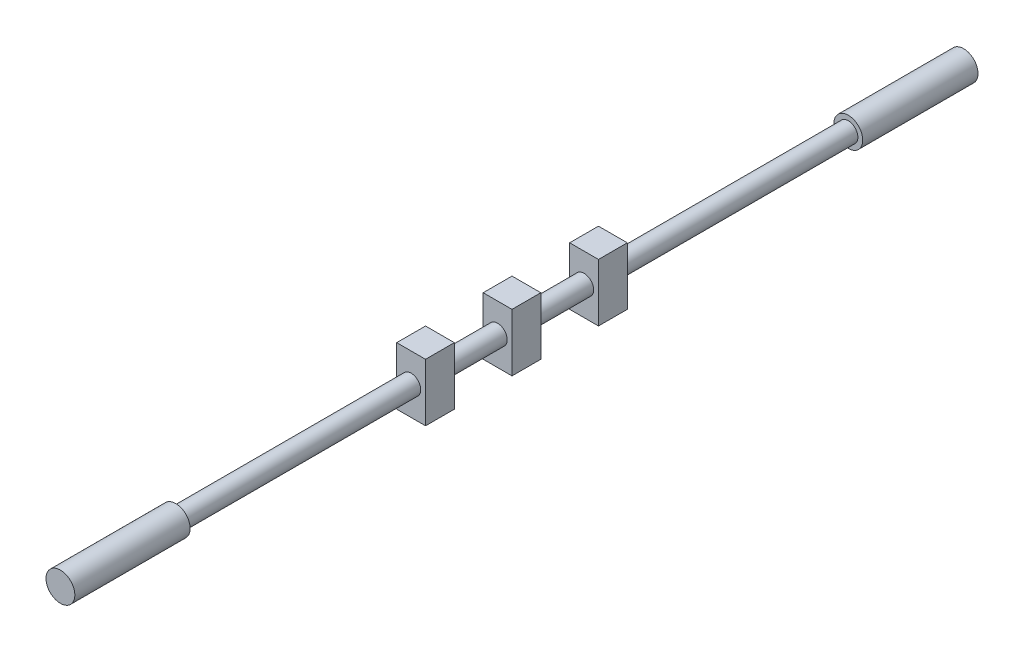
ISO-10303-21;
HEADER;
FILE_DESCRIPTION(('STEP AP214'),'2;1');
FILE_NAME('part.step','',(''),(''),'','','');
FILE_SCHEMA(('AUTOMOTIVE_DESIGN { 1 0 10303 214 1 1 1 1 }'));
ENDSEC;
DATA;
#1=APPLICATION_CONTEXT('core data for automotive mechanical design processes');
#2=APPLICATION_PROTOCOL_DEFINITION('international standard','automotive_design',2000,#1);
#3=PRODUCT_CONTEXT('',#1,'mechanical');
#4=PRODUCT('Part','Part','',(#3));
#5=PRODUCT_RELATED_PRODUCT_CATEGORY('part','',(#4));
#6=PRODUCT_DEFINITION_FORMATION('','',#4);
#7=PRODUCT_DEFINITION_CONTEXT('part definition',#1,'design');
#8=PRODUCT_DEFINITION('design','',#6,#7);
#9=PRODUCT_DEFINITION_SHAPE('','',#8);
#10=(LENGTH_UNIT() NAMED_UNIT(*) SI_UNIT(.MILLI.,.METRE.));
#11=(NAMED_UNIT(*) PLANE_ANGLE_UNIT() SI_UNIT($,.RADIAN.));
#12=(NAMED_UNIT(*) SI_UNIT($,.STERADIAN.) SOLID_ANGLE_UNIT());
#13=UNCERTAINTY_MEASURE_WITH_UNIT(LENGTH_MEASURE(1.E-05),#10,'distance_accuracy_value','');
#14=(GEOMETRIC_REPRESENTATION_CONTEXT(3) GLOBAL_UNCERTAINTY_ASSIGNED_CONTEXT((#13)) GLOBAL_UNIT_ASSIGNED_CONTEXT((#10,
#11,#12)) REPRESENTATION_CONTEXT('',''));
#15=CARTESIAN_POINT('',(0.,0.,0.));
#16=DIRECTION('',(0.,0.,1.));
#17=DIRECTION('',(1.,0.,0.));
#18=AXIS2_PLACEMENT_3D('',#15,#16,#17);
#19=CARTESIAN_POINT('',(0.,0.,1778.));
#20=DIRECTION('',(0.,0.,-1.));
#21=DIRECTION('',(-1.,0.,0.));
#22=AXIS2_PLACEMENT_3D('',#19,#20,#21);
#23=CYLINDRICAL_SURFACE('',#22,25.4);
#24=CARTESIAN_POINT('',(0.,0.,850.9));
#25=DIRECTION('',(0.,0.,1.));
#26=DIRECTION('',(1.,0.,0.));
#27=AXIS2_PLACEMENT_3D('',#24,#25,#26);
#28=CIRCLE('',#27,25.4);
#29=CARTESIAN_POINT('',(25.4,0.,850.9));
#30=VERTEX_POINT('',#29);
#31=EDGE_CURVE('E240',#30,#30,#28,.T.);
#32=ORIENTED_EDGE('',*,*,#31,.F.);
#33=EDGE_LOOP('',(#32));
#34=FACE_BOUND('',#33,.T.);
#35=CARTESIAN_POINT('',(0.,0.,698.5));
#36=DIRECTION('',(0.,0.,-1.));
#37=DIRECTION('',(-1.,0.,0.));
#38=AXIS2_PLACEMENT_3D('',#35,#36,#37);
#39=CIRCLE('',#38,25.4);
#40=CARTESIAN_POINT('',(-25.4,0.,698.5));
#41=VERTEX_POINT('',#40);
#42=EDGE_CURVE('E11',#41,#41,#39,.T.);
#43=ORIENTED_EDGE('',*,*,#42,.F.);
#44=EDGE_LOOP('',(#43));
#45=FACE_BOUND('',#44,.T.);
#46=ADVANCED_FACE('F37',(#34,#45),#23,.T.);
#47=CARTESIAN_POINT('',(0.,0.,927.1));
#48=DIRECTION('',(0.,0.,-1.));
#49=DIRECTION('',(-1.,0.,0.));
#50=AXIS2_PLACEMENT_3D('',#47,#48,#49);
#51=CIRCLE('',#50,25.4);
#52=CARTESIAN_POINT('',(-25.4,0.,927.1));
#53=VERTEX_POINT('',#52);
#54=EDGE_CURVE('E245',#53,#53,#51,.T.);
#55=ORIENTED_EDGE('',*,*,#54,.F.);
#56=EDGE_LOOP('',(#55));
#57=FACE_BOUND('',#56,.T.);
#58=CARTESIAN_POINT('',(0.,0.,1079.5));
#59=DIRECTION('',(0.,0.,1.));
#60=DIRECTION('',(1.,0.,0.));
#61=AXIS2_PLACEMENT_3D('',#58,#59,#60);
#62=CIRCLE('',#61,25.4);
#63=CARTESIAN_POINT('',(25.4,0.,1079.5));
#64=VERTEX_POINT('',#63);
#65=EDGE_CURVE('E248',#64,#64,#62,.T.);
#66=ORIENTED_EDGE('',*,*,#65,.F.);
#67=EDGE_LOOP('',(#66));
#68=FACE_BOUND('',#67,.T.);
#69=ADVANCED_FACE('F261',(#57,#68),#23,.T.);
#70=CARTESIAN_POINT('',(-38.1,76.2,850.9));
#71=DIRECTION('',(1.,0.,0.));
#72=DIRECTION('',(0.,0.,-1.));
#73=AXIS2_PLACEMENT_3D('',#70,#71,#72);
#74=PLANE('',#73);
#75=DIRECTION('',(0.,0.,1.));
#76=VECTOR('',#75,1.);
#77=CARTESIAN_POINT('',(-38.1,-76.2,850.9));
#78=LINE('',#77,#76);
#79=CARTESIAN_POINT('',(-38.1,-76.2,850.9));
#80=VERTEX_POINT('',#79);
#81=CARTESIAN_POINT('',(-38.1,-76.2,927.1));
#82=VERTEX_POINT('',#81);
#83=EDGE_CURVE('E196',#80,#82,#78,.T.);
#84=ORIENTED_EDGE('',*,*,#83,.T.);
#85=DIRECTION('',(0.,-1.,0.));
#86=VECTOR('',#85,1.);
#87=CARTESIAN_POINT('',(-38.1,76.2,927.1));
#88=LINE('',#87,#86);
#89=CARTESIAN_POINT('',(-38.1,76.2,927.1));
#90=VERTEX_POINT('',#89);
#91=EDGE_CURVE('E222',#90,#82,#88,.T.);
#92=ORIENTED_EDGE('',*,*,#91,.F.);
#93=DIRECTION('',(0.,0.,1.));
#94=VECTOR('',#93,1.);
#95=CARTESIAN_POINT('',(-38.1,76.2,850.9));
#96=LINE('',#95,#94);
#97=CARTESIAN_POINT('',(-38.1,76.2,850.9));
#98=VERTEX_POINT('',#97);
#99=EDGE_CURVE('E204',#98,#90,#96,.T.);
#100=ORIENTED_EDGE('',*,*,#99,.F.);
#101=DIRECTION('',(0.,-1.,0.));
#102=VECTOR('',#101,1.);
#103=CARTESIAN_POINT('',(-38.1,76.2,850.9));
#104=LINE('',#103,#102);
#105=EDGE_CURVE('E210',#98,#80,#104,.T.);
#106=ORIENTED_EDGE('',*,*,#105,.T.);
#107=EDGE_LOOP('',(#84,#92,#100,#106));
#108=FACE_BOUND('',#107,.T.);
#109=ADVANCED_FACE('F269',(#108),#74,.F.);
#110=CARTESIAN_POINT('',(-38.1,76.2,927.1));
#111=DIRECTION('',(0.,0.,-1.));
#112=DIRECTION('',(-1.,0.,0.));
#113=AXIS2_PLACEMENT_3D('',#110,#111,#112);
#114=PLANE('',#113);
#115=ORIENTED_EDGE('',*,*,#54,.T.);
#116=EDGE_LOOP('',(#115));
#117=FACE_BOUND('',#116,.T.);
#118=DIRECTION('',(1.,0.,0.));
#119=VECTOR('',#118,1.);
#120=CARTESIAN_POINT('',(-38.1,-76.2,927.1));
#121=LINE('',#120,#119);
#122=CARTESIAN_POINT('',(38.1,-76.2,927.1));
#123=VERTEX_POINT('',#122);
#124=EDGE_CURVE('E213',#82,#123,#121,.T.);
#125=ORIENTED_EDGE('',*,*,#124,.T.);
#126=DIRECTION('',(0.,-1.,0.));
#127=VECTOR('',#126,1.);
#128=CARTESIAN_POINT('',(38.1,76.2,927.1));
#129=LINE('',#128,#127);
#130=CARTESIAN_POINT('',(38.1,76.2,927.1));
#131=VERTEX_POINT('',#130);
#132=EDGE_CURVE('E220',#131,#123,#129,.T.);
#133=ORIENTED_EDGE('',*,*,#132,.F.);
#134=DIRECTION('',(1.,0.,0.));
#135=VECTOR('',#134,1.);
#136=CARTESIAN_POINT('',(-38.1,76.2,927.1));
#137=LINE('',#136,#135);
#138=EDGE_CURVE('E86',#90,#131,#137,.T.);
#139=ORIENTED_EDGE('',*,*,#138,.F.);
#140=ORIENTED_EDGE('',*,*,#91,.T.);
#141=EDGE_LOOP('',(#125,#133,#139,#140));
#142=FACE_BOUND('',#141,.T.);
#143=ADVANCED_FACE('F342',(#117,#142),#114,.F.);
#144=CARTESIAN_POINT('',(38.1,76.2,850.9));
#145=DIRECTION('',(-1.,0.,0.));
#146=DIRECTION('',(0.,0.,1.));
#147=AXIS2_PLACEMENT_3D('',#144,#145,#146);
#148=PLANE('',#147);
#149=DIRECTION('',(0.,0.,-1.));
#150=VECTOR('',#149,1.);
#151=CARTESIAN_POINT('',(38.1,-76.2,850.9));
#152=LINE('',#151,#150);
#153=CARTESIAN_POINT('',(38.1,-76.2,850.9));
#154=VERTEX_POINT('',#153);
#155=EDGE_CURVE('E72',#123,#154,#152,.T.);
#156=ORIENTED_EDGE('',*,*,#155,.T.);
#157=DIRECTION('',(0.,-1.,0.));
#158=VECTOR('',#157,1.);
#159=CARTESIAN_POINT('',(38.1,76.2,850.9));
#160=LINE('',#159,#158);
#161=CARTESIAN_POINT('',(38.1,76.2,850.9));
#162=VERTEX_POINT('',#161);
#163=EDGE_CURVE('E218',#162,#154,#160,.T.);
#164=ORIENTED_EDGE('',*,*,#163,.F.);
#165=DIRECTION('',(0.,0.,-1.));
#166=VECTOR('',#165,1.);
#167=CARTESIAN_POINT('',(38.1,76.2,850.9));
#168=LINE('',#167,#166);
#169=EDGE_CURVE('E207',#131,#162,#168,.T.);
#170=ORIENTED_EDGE('',*,*,#169,.F.);
#171=ORIENTED_EDGE('',*,*,#132,.T.);
#172=EDGE_LOOP('',(#156,#164,#170,#171));
#173=FACE_BOUND('',#172,.T.);
#174=ADVANCED_FACE('F338',(#173),#148,.F.);
#175=CARTESIAN_POINT('',(-38.1,76.2,850.9));
#176=DIRECTION('',(0.,0.,1.));
#177=DIRECTION('',(1.,0.,0.));
#178=AXIS2_PLACEMENT_3D('',#175,#176,#177);
#179=PLANE('',#178);
#180=ORIENTED_EDGE('',*,*,#31,.T.);
#181=EDGE_LOOP('',(#180));
#182=FACE_BOUND('',#181,.T.);
#183=DIRECTION('',(-1.,0.,0.));
#184=VECTOR('',#183,1.);
#185=CARTESIAN_POINT('',(-38.1,-76.2,850.9));
#186=LINE('',#185,#184);
#187=EDGE_CURVE('E78',#154,#80,#186,.T.);
#188=ORIENTED_EDGE('',*,*,#187,.T.);
#189=ORIENTED_EDGE('',*,*,#105,.F.);
#190=DIRECTION('',(-1.,0.,0.));
#191=VECTOR('',#190,1.);
#192=CARTESIAN_POINT('',(-38.1,76.2,850.9));
#193=LINE('',#192,#191);
#194=EDGE_CURVE('E54',#162,#98,#193,.T.);
#195=ORIENTED_EDGE('',*,*,#194,.F.);
#196=ORIENTED_EDGE('',*,*,#163,.T.);
#197=EDGE_LOOP('',(#188,#189,#195,#196));
#198=FACE_BOUND('',#197,.T.);
#199=ADVANCED_FACE('F332',(#182,#198),#179,.F.);
#200=CARTESIAN_POINT('',(0.,76.2,0.));
#201=DIRECTION('',(0.,1.,0.));
#202=DIRECTION('',(0.,0.,1.));
#203=AXIS2_PLACEMENT_3D('',#200,#201,#202);
#204=PLANE('',#203);
#205=ORIENTED_EDGE('',*,*,#99,.T.);
#206=ORIENTED_EDGE('',*,*,#138,.T.);
#207=ORIENTED_EDGE('',*,*,#169,.T.);
#208=ORIENTED_EDGE('',*,*,#194,.T.);
#209=EDGE_LOOP('',(#205,#206,#207,#208));
#210=FACE_BOUND('',#209,.T.);
#211=ADVANCED_FACE('F328',(#210),#204,.T.);
#212=CARTESIAN_POINT('',(0.,-76.2,0.));
#213=DIRECTION('',(0.,1.,0.));
#214=DIRECTION('',(0.,0.,1.));
#215=AXIS2_PLACEMENT_3D('',#212,#213,#214);
#216=PLANE('',#215);
#217=ORIENTED_EDGE('',*,*,#83,.F.);
#218=ORIENTED_EDGE('',*,*,#187,.F.);
#219=ORIENTED_EDGE('',*,*,#155,.F.);
#220=ORIENTED_EDGE('',*,*,#124,.F.);
#221=EDGE_LOOP('',(#217,#218,#219,#220));
#222=FACE_BOUND('',#221,.T.);
#223=ADVANCED_FACE('F331',(#222),#216,.F.);
#224=CARTESIAN_POINT('',(-38.1,76.2,1079.5));
#225=DIRECTION('',(1.,0.,0.));
#226=DIRECTION('',(0.,0.,-1.));
#227=AXIS2_PLACEMENT_3D('',#224,#225,#226);
#228=PLANE('',#227);
#229=DIRECTION('',(0.,0.,1.));
#230=VECTOR('',#229,1.);
#231=CARTESIAN_POINT('',(-38.1,-76.2,1079.5));
#232=LINE('',#231,#230);
#233=CARTESIAN_POINT('',(-38.1,-76.2,1079.5));
#234=VERTEX_POINT('',#233);
#235=CARTESIAN_POINT('',(-38.1,-76.2,1155.7));
#236=VERTEX_POINT('',#235);
#237=EDGE_CURVE('E193',#234,#236,#232,.T.);
#238=ORIENTED_EDGE('',*,*,#237,.T.);
#239=DIRECTION('',(0.,-1.,0.));
#240=VECTOR('',#239,1.);
#241=CARTESIAN_POINT('',(-38.1,76.2,1155.7));
#242=LINE('',#241,#240);
#243=CARTESIAN_POINT('',(-38.1,76.2,1155.7));
#244=VERTEX_POINT('',#243);
#245=EDGE_CURVE('E163',#244,#236,#242,.T.);
#246=ORIENTED_EDGE('',*,*,#245,.F.);
#247=DIRECTION('',(0.,0.,1.));
#248=VECTOR('',#247,1.);
#249=CARTESIAN_POINT('',(-38.1,76.2,1079.5));
#250=LINE('',#249,#248);
#251=CARTESIAN_POINT('',(-38.1,76.2,1079.5));
#252=VERTEX_POINT('',#251);
#253=EDGE_CURVE('E189',#252,#244,#250,.T.);
#254=ORIENTED_EDGE('',*,*,#253,.F.);
#255=DIRECTION('',(0.,-1.,0.));
#256=VECTOR('',#255,1.);
#257=CARTESIAN_POINT('',(-38.1,76.2,1079.5));
#258=LINE('',#257,#256);
#259=EDGE_CURVE('E182',#252,#234,#258,.T.);
#260=ORIENTED_EDGE('',*,*,#259,.T.);
#261=EDGE_LOOP('',(#238,#246,#254,#260));
#262=FACE_BOUND('',#261,.T.);
#263=ADVANCED_FACE('F297',(#262),#228,.F.);
#264=CARTESIAN_POINT('',(-38.1,76.2,1155.7));
#265=DIRECTION('',(0.,0.,-1.));
#266=DIRECTION('',(-1.,0.,0.));
#267=AXIS2_PLACEMENT_3D('',#264,#265,#266);
#268=PLANE('',#267);
#269=CARTESIAN_POINT('',(0.,0.,1155.7));
#270=DIRECTION('',(0.,0.,-1.));
#271=DIRECTION('',(-1.,0.,0.));
#272=AXIS2_PLACEMENT_3D('',#269,#270,#271);
#273=CIRCLE('',#272,25.4);
#274=CARTESIAN_POINT('',(-25.4,0.,1155.7));
#275=VERTEX_POINT('',#274);
#276=EDGE_CURVE('E251',#275,#275,#273,.T.);
#277=ORIENTED_EDGE('',*,*,#276,.T.);
#278=EDGE_LOOP('',(#277));
#279=FACE_BOUND('',#278,.T.);
#280=DIRECTION('',(1.,0.,0.));
#281=VECTOR('',#280,1.);
#282=CARTESIAN_POINT('',(-38.1,-76.2,1155.7));
#283=LINE('',#282,#281);
#284=CARTESIAN_POINT('',(38.1,-76.2,1155.7));
#285=VERTEX_POINT('',#284);
#286=EDGE_CURVE('E191',#236,#285,#283,.T.);
#287=ORIENTED_EDGE('',*,*,#286,.T.);
#288=DIRECTION('',(0.,-1.,0.));
#289=VECTOR('',#288,1.);
#290=CARTESIAN_POINT('',(38.1,76.2,1155.7));
#291=LINE('',#290,#289);
#292=CARTESIAN_POINT('',(38.1,76.2,1155.7));
#293=VERTEX_POINT('',#292);
#294=EDGE_CURVE('E166',#293,#285,#291,.T.);
#295=ORIENTED_EDGE('',*,*,#294,.F.);
#296=DIRECTION('',(1.,0.,0.));
#297=VECTOR('',#296,1.);
#298=CARTESIAN_POINT('',(-38.1,76.2,1155.7));
#299=LINE('',#298,#297);
#300=EDGE_CURVE('E200',#244,#293,#299,.T.);
#301=ORIENTED_EDGE('',*,*,#300,.F.);
#302=ORIENTED_EDGE('',*,*,#245,.T.);
#303=EDGE_LOOP('',(#287,#295,#301,#302));
#304=FACE_BOUND('',#303,.T.);
#305=ADVANCED_FACE('F293',(#279,#304),#268,.F.);
#306=CARTESIAN_POINT('',(38.1,76.2,1079.5));
#307=DIRECTION('',(-1.,0.,0.));
#308=DIRECTION('',(0.,0.,1.));
#309=AXIS2_PLACEMENT_3D('',#306,#307,#308);
#310=PLANE('',#309);
#311=DIRECTION('',(0.,0.,-1.));
#312=VECTOR('',#311,1.);
#313=CARTESIAN_POINT('',(38.1,-76.2,1079.5));
#314=LINE('',#313,#312);
#315=CARTESIAN_POINT('',(38.1,-76.2,1079.5));
#316=VERTEX_POINT('',#315);
#317=EDGE_CURVE('E188',#285,#316,#314,.T.);
#318=ORIENTED_EDGE('',*,*,#317,.T.);
#319=DIRECTION('',(0.,-1.,0.));
#320=VECTOR('',#319,1.);
#321=CARTESIAN_POINT('',(38.1,76.2,1079.5));
#322=LINE('',#321,#320);
#323=CARTESIAN_POINT('',(38.1,76.2,1079.5));
#324=VERTEX_POINT('',#323);
#325=EDGE_CURVE('E179',#324,#316,#322,.T.);
#326=ORIENTED_EDGE('',*,*,#325,.F.);
#327=DIRECTION('',(0.,0.,-1.));
#328=VECTOR('',#327,1.);
#329=CARTESIAN_POINT('',(38.1,76.2,1079.5));
#330=LINE('',#329,#328);
#331=EDGE_CURVE('E198',#293,#324,#330,.T.);
#332=ORIENTED_EDGE('',*,*,#331,.F.);
#333=ORIENTED_EDGE('',*,*,#294,.T.);
#334=EDGE_LOOP('',(#318,#326,#332,#333));
#335=FACE_BOUND('',#334,.T.);
#336=ADVANCED_FACE('F296',(#335),#310,.F.);
#337=CARTESIAN_POINT('',(-38.1,76.2,1079.5));
#338=DIRECTION('',(0.,0.,1.));
#339=DIRECTION('',(1.,0.,0.));
#340=AXIS2_PLACEMENT_3D('',#337,#338,#339);
#341=PLANE('',#340);
#342=ORIENTED_EDGE('',*,*,#65,.T.);
#343=EDGE_LOOP('',(#342));
#344=FACE_BOUND('',#343,.T.);
#345=DIRECTION('',(-1.,0.,0.));
#346=VECTOR('',#345,1.);
#347=CARTESIAN_POINT('',(-38.1,-76.2,1079.5));
#348=LINE('',#347,#346);
#349=EDGE_CURVE('E186',#316,#234,#348,.T.);
#350=ORIENTED_EDGE('',*,*,#349,.T.);
#351=ORIENTED_EDGE('',*,*,#259,.F.);
#352=DIRECTION('',(-1.,0.,0.));
#353=VECTOR('',#352,1.);
#354=CARTESIAN_POINT('',(-38.1,76.2,1079.5));
#355=LINE('',#354,#353);
#356=EDGE_CURVE('E185',#324,#252,#355,.T.);
#357=ORIENTED_EDGE('',*,*,#356,.F.);
#358=ORIENTED_EDGE('',*,*,#325,.T.);
#359=EDGE_LOOP('',(#350,#351,#357,#358));
#360=FACE_BOUND('',#359,.T.);
#361=ADVANCED_FACE('F311',(#344,#360),#341,.F.);
#362=CARTESIAN_POINT('',(0.,76.2,0.));
#363=DIRECTION('',(0.,1.,0.));
#364=DIRECTION('',(0.,0.,1.));
#365=AXIS2_PLACEMENT_3D('',#362,#363,#364);
#366=PLANE('',#365);
#367=ORIENTED_EDGE('',*,*,#253,.T.);
#368=ORIENTED_EDGE('',*,*,#300,.T.);
#369=ORIENTED_EDGE('',*,*,#331,.T.);
#370=ORIENTED_EDGE('',*,*,#356,.T.);
#371=EDGE_LOOP('',(#367,#368,#369,#370));
#372=FACE_BOUND('',#371,.T.);
#373=ADVANCED_FACE('F316',(#372),#366,.T.);
#374=CARTESIAN_POINT('',(0.,-76.2,0.));
#375=DIRECTION('',(0.,1.,0.));
#376=DIRECTION('',(0.,0.,1.));
#377=AXIS2_PLACEMENT_3D('',#374,#375,#376);
#378=PLANE('',#377);
#379=ORIENTED_EDGE('',*,*,#237,.F.);
#380=ORIENTED_EDGE('',*,*,#349,.F.);
#381=ORIENTED_EDGE('',*,*,#317,.F.);
#382=ORIENTED_EDGE('',*,*,#286,.F.);
#383=EDGE_LOOP('',(#379,#380,#381,#382));
#384=FACE_BOUND('',#383,.T.);
#385=ADVANCED_FACE('F308',(#384),#378,.F.);
#386=CARTESIAN_POINT('',(0.,0.,2082.8));
#387=DIRECTION('',(0.,0.,1.));
#388=DIRECTION('',(1.,0.,0.));
#389=AXIS2_PLACEMENT_3D('',#386,#387,#388);
#390=PLANE('',#389);
#391=CARTESIAN_POINT('',(0.,0.,2082.8));
#392=DIRECTION('',(0.,0.,1.));
#393=DIRECTION('',(1.,0.,0.));
#394=AXIS2_PLACEMENT_3D('',#391,#392,#393);
#395=CIRCLE('',#394,38.1);
#396=CARTESIAN_POINT('',(-38.1,0.,2082.8));
#397=VERTEX_POINT('',#396);
#398=EDGE_CURVE('E231',#397,#397,#395,.T.);
#399=ORIENTED_EDGE('',*,*,#398,.T.);
#400=EDGE_LOOP('',(#399));
#401=FACE_BOUND('',#400,.T.);
#402=ADVANCED_FACE('F323',(#401),#390,.T.);
#403=CARTESIAN_POINT('',(0.,0.,2082.8));
#404=DIRECTION('',(0.,0.,-1.));
#405=DIRECTION('',(-1.,0.,0.));
#406=AXIS2_PLACEMENT_3D('',#403,#404,#405);
#407=CYLINDRICAL_SURFACE('',#406,38.1);
#408=CARTESIAN_POINT('',(0.,0.,1778.));
#409=DIRECTION('',(0.,0.,1.));
#410=DIRECTION('',(1.,0.,0.));
#411=AXIS2_PLACEMENT_3D('',#408,#409,#410);
#412=CIRCLE('',#411,38.1);
#413=CARTESIAN_POINT('',(-38.1,0.,1778.));
#414=VERTEX_POINT('',#413);
#415=EDGE_CURVE('E235',#414,#414,#412,.T.);
#416=CARTESIAN_POINT('',(-38.1,0.,2082.8));
#417=CARTESIAN_POINT('',(-38.1,0.,2079.625));
#418=CARTESIAN_POINT('',(-38.1,0.,2076.45));
#419=CARTESIAN_POINT('',(-38.1,0.,2070.1));
#420=CARTESIAN_POINT('',(-38.1,0.,2066.925));
#421=CARTESIAN_POINT('',(-38.1,0.,2060.575));
#422=CARTESIAN_POINT('',(-38.1,0.,2057.4));
#423=CARTESIAN_POINT('',(-38.1,0.,2051.05));
#424=CARTESIAN_POINT('',(-38.1,0.,2047.875));
#425=CARTESIAN_POINT('',(-38.1,0.,2041.525));
#426=CARTESIAN_POINT('',(-38.1,0.,2038.35));
#427=CARTESIAN_POINT('',(-38.1,0.,2032.));
#428=CARTESIAN_POINT('',(-38.1,0.,2028.825));
#429=CARTESIAN_POINT('',(-38.1,0.,2022.475));
#430=CARTESIAN_POINT('',(-38.1,0.,2019.3));
#431=CARTESIAN_POINT('',(-38.1,0.,2012.95));
#432=CARTESIAN_POINT('',(-38.1,0.,2009.775));
#433=CARTESIAN_POINT('',(-38.1,0.,2003.425));
#434=CARTESIAN_POINT('',(-38.1,0.,2000.25));
#435=CARTESIAN_POINT('',(-38.1,0.,1993.9));
#436=CARTESIAN_POINT('',(-38.1,0.,1990.725));
#437=CARTESIAN_POINT('',(-38.1,0.,1984.375));
#438=CARTESIAN_POINT('',(-38.1,0.,1981.2));
#439=CARTESIAN_POINT('',(-38.1,0.,1974.85));
#440=CARTESIAN_POINT('',(-38.1,0.,1971.675));
#441=CARTESIAN_POINT('',(-38.1,0.,1965.325));
#442=CARTESIAN_POINT('',(-38.1,0.,1962.15));
#443=CARTESIAN_POINT('',(-38.1,0.,1955.8));
#444=CARTESIAN_POINT('',(-38.1,0.,1952.625));
#445=CARTESIAN_POINT('',(-38.1,0.,1946.275));
#446=CARTESIAN_POINT('',(-38.1,0.,1943.1));
#447=CARTESIAN_POINT('',(-38.1,0.,1936.75));
#448=CARTESIAN_POINT('',(-38.1,0.,1933.575));
#449=CARTESIAN_POINT('',(-38.1,0.,1927.225));
#450=CARTESIAN_POINT('',(-38.1,0.,1924.05));
#451=CARTESIAN_POINT('',(-38.1,0.,1917.7));
#452=CARTESIAN_POINT('',(-38.1,0.,1914.525));
#453=CARTESIAN_POINT('',(-38.1,0.,1908.175));
#454=CARTESIAN_POINT('',(-38.1,0.,1905.));
#455=CARTESIAN_POINT('',(-38.1,0.,1898.65));
#456=CARTESIAN_POINT('',(-38.1,0.,1895.475));
#457=CARTESIAN_POINT('',(-38.1,0.,1889.125));
#458=CARTESIAN_POINT('',(-38.1,0.,1885.95));
#459=CARTESIAN_POINT('',(-38.1,0.,1879.6));
#460=CARTESIAN_POINT('',(-38.1,0.,1876.425));
#461=CARTESIAN_POINT('',(-38.1,0.,1870.075));
#462=CARTESIAN_POINT('',(-38.1,0.,1866.9));
#463=CARTESIAN_POINT('',(-38.1,0.,1860.55));
#464=CARTESIAN_POINT('',(-38.1,0.,1857.375));
#465=CARTESIAN_POINT('',(-38.1,0.,1851.025));
#466=CARTESIAN_POINT('',(-38.1,0.,1847.85));
#467=CARTESIAN_POINT('',(-38.1,0.,1841.5));
#468=CARTESIAN_POINT('',(-38.1,0.,1838.325));
#469=CARTESIAN_POINT('',(-38.1,0.,1831.975));
#470=CARTESIAN_POINT('',(-38.1,0.,1828.8));
#471=CARTESIAN_POINT('',(-38.1,0.,1822.45));
#472=CARTESIAN_POINT('',(-38.1,0.,1819.275));
#473=CARTESIAN_POINT('',(-38.1,0.,1812.925));
#474=CARTESIAN_POINT('',(-38.1,0.,1809.75));
#475=CARTESIAN_POINT('',(-38.1,0.,1803.4));
#476=CARTESIAN_POINT('',(-38.1,0.,1800.225));
#477=CARTESIAN_POINT('',(-38.1,0.,1793.875));
#478=CARTESIAN_POINT('',(-38.1,0.,1790.7));
#479=CARTESIAN_POINT('',(-38.1,0.,1784.35));
#480=CARTESIAN_POINT('',(-38.1,0.,1781.175));
#481=CARTESIAN_POINT('',(-38.1,0.,1778.));
#482=B_SPLINE_CURVE_WITH_KNOTS('',3,(#416,#417,#418,#419,#420,#421,#422,#423,#424,#425,#426,
#427,#428,#429,#430,#431,#432,#433,#434,#435,#436,#437,#438,#439,#440,#441,#442,#443,#444,#445,
#446,#447,#448,#449,#450,#451,#452,#453,#454,#455,#456,#457,#458,#459,#460,#461,#462,#463,#464,
#465,#466,#467,#468,#469,#470,#471,#472,#473,#474,#475,#476,#477,#478,#479,#480,#481),
.UNSPECIFIED.,.F.,.F.,(4,2,2,2,2,2,2,2,2,2,2,2,2,2,2,2,2,2,2,2,2,2,2,2,2,2,2,2,2,2,2,2,4),(0.,
9.52500000000001,19.05,28.575,38.1,47.625,57.15,66.675,76.2,85.7250000000003,95.2500000000003,
104.775,114.3,123.825,133.35,142.875,152.4,161.925,171.45,180.975,190.5,200.025,209.55,219.075,
228.6,238.125,247.65,257.175,266.7,276.225,285.75,295.275,304.8),.UNSPECIFIED.);
#483=EDGE_CURVE('BSEAM286',#397,#414,#482,.T.);
#484=ORIENTED_EDGE('',*,*,#398,.F.);
#485=ORIENTED_EDGE('',*,*,#415,.T.);
#486=ORIENTED_EDGE('',*,*,#483,.T.);
#487=ORIENTED_EDGE('',*,*,#483,.F.);
#488=EDGE_LOOP('',(#484,#486,#485,#487));
#489=FACE_BOUND('',#488,.T.);
#490=ADVANCED_FACE('F286',(#489),#407,.T.);
#491=CARTESIAN_POINT('',(0.,0.,1778.));
#492=DIRECTION('',(0.,0.,1.));
#493=DIRECTION('',(1.,0.,0.));
#494=AXIS2_PLACEMENT_3D('',#491,#492,#493);
#495=PLANE('',#494);
#496=CARTESIAN_POINT('',(0.,0.,1778.));
#497=DIRECTION('',(0.,0.,1.));
#498=DIRECTION('',(1.,0.,0.));
#499=AXIS2_PLACEMENT_3D('',#496,#497,#498);
#500=CIRCLE('',#499,25.4);
#501=CARTESIAN_POINT('',(25.4,0.,1778.));
#502=VERTEX_POINT('',#501);
#503=EDGE_CURVE('E234',#502,#502,#500,.T.);
#504=ORIENTED_EDGE('',*,*,#503,.T.);
#505=EDGE_LOOP('',(#504));
#506=FACE_BOUND('',#505,.T.);
#507=ORIENTED_EDGE('',*,*,#415,.F.);
#508=EDGE_LOOP('',(#507));
#509=FACE_BOUND('',#508,.T.);
#510=ADVANCED_FACE('F278',(#506,#509),#495,.F.);
#511=ORIENTED_EDGE('',*,*,#503,.F.);
#512=EDGE_LOOP('',(#511));
#513=FACE_BOUND('',#512,.T.);
#514=ORIENTED_EDGE('',*,*,#276,.F.);
#515=EDGE_LOOP('',(#514));
#516=FACE_BOUND('',#515,.T.);
#517=ADVANCED_FACE('F39',(#513,#516),#23,.T.);
#518=CARTESIAN_POINT('',(-38.1,76.2,622.3));
#519=DIRECTION('',(1.,0.,0.));
#520=DIRECTION('',(0.,0.,-1.));
#521=AXIS2_PLACEMENT_3D('',#518,#519,#520);
#522=PLANE('',#521);
#523=DIRECTION('',(0.,0.,1.));
#524=VECTOR('',#523,1.);
#525=CARTESIAN_POINT('',(-38.1,-76.2,622.3));
#526=LINE('',#525,#524);
#527=CARTESIAN_POINT('',(-38.1,-76.2,622.3));
#528=VERTEX_POINT('',#527);
#529=CARTESIAN_POINT('',(-38.1,-76.2,698.5));
#530=VERTEX_POINT('',#529);
#531=EDGE_CURVE('E156',#528,#530,#526,.T.);
#532=ORIENTED_EDGE('',*,*,#531,.T.);
#533=DIRECTION('',(0.,-1.,0.));
#534=VECTOR('',#533,1.);
#535=CARTESIAN_POINT('',(-38.1,76.2,698.5));
#536=LINE('',#535,#534);
#537=CARTESIAN_POINT('',(-38.1,76.2,698.5));
#538=VERTEX_POINT('',#537);
#539=EDGE_CURVE('E600',#538,#530,#536,.T.);
#540=ORIENTED_EDGE('',*,*,#539,.F.);
#541=DIRECTION('',(0.,0.,1.));
#542=VECTOR('',#541,1.);
#543=CARTESIAN_POINT('',(-38.1,76.2,622.3));
#544=LINE('',#543,#542);
#545=CARTESIAN_POINT('',(-38.1,76.2,622.3));
#546=VERTEX_POINT('',#545);
#547=EDGE_CURVE('E150',#546,#538,#544,.T.);
#548=ORIENTED_EDGE('',*,*,#547,.F.);
#549=DIRECTION('',(0.,-1.,0.));
#550=VECTOR('',#549,1.);
#551=CARTESIAN_POINT('',(-38.1,76.2,622.3));
#552=LINE('',#551,#550);
#553=EDGE_CURVE('E142',#546,#528,#552,.T.);
#554=ORIENTED_EDGE('',*,*,#553,.T.);
#555=EDGE_LOOP('',(#532,#540,#548,#554));
#556=FACE_BOUND('',#555,.T.);
#557=ADVANCED_FACE('F154',(#556),#522,.F.);
#558=CARTESIAN_POINT('',(-38.1,76.2,698.5));
#559=DIRECTION('',(0.,0.,-1.));
#560=DIRECTION('',(-1.,0.,0.));
#561=AXIS2_PLACEMENT_3D('',#558,#559,#560);
#562=PLANE('',#561);
#563=ORIENTED_EDGE('',*,*,#42,.T.);
#564=EDGE_LOOP('',(#563));
#565=FACE_BOUND('',#564,.T.);
#566=DIRECTION('',(1.,0.,0.));
#567=VECTOR('',#566,1.);
#568=CARTESIAN_POINT('',(-38.1,-76.2,698.5));
#569=LINE('',#568,#567);
#570=CARTESIAN_POINT('',(38.1,-76.2,698.5));
#571=VERTEX_POINT('',#570);
#572=EDGE_CURVE('E161',#530,#571,#569,.T.);
#573=ORIENTED_EDGE('',*,*,#572,.T.);
#574=DIRECTION('',(0.,-1.,0.));
#575=VECTOR('',#574,1.);
#576=CARTESIAN_POINT('',(38.1,76.2,698.5));
#577=LINE('',#576,#575);
#578=CARTESIAN_POINT('',(38.1,76.2,698.5));
#579=VERTEX_POINT('',#578);
#580=EDGE_CURVE('E602',#579,#571,#577,.T.);
#581=ORIENTED_EDGE('',*,*,#580,.F.);
#582=DIRECTION('',(1.,0.,0.));
#583=VECTOR('',#582,1.);
#584=CARTESIAN_POINT('',(-38.1,76.2,698.5));
#585=LINE('',#584,#583);
#586=EDGE_CURVE('E174',#538,#579,#585,.T.);
#587=ORIENTED_EDGE('',*,*,#586,.F.);
#588=ORIENTED_EDGE('',*,*,#539,.T.);
#589=EDGE_LOOP('',(#573,#581,#587,#588));
#590=FACE_BOUND('',#589,.T.);
#591=ADVANCED_FACE('F284',(#565,#590),#562,.F.);
#592=CARTESIAN_POINT('',(38.1,76.2,622.3));
#593=DIRECTION('',(-1.,0.,0.));
#594=DIRECTION('',(0.,0.,1.));
#595=AXIS2_PLACEMENT_3D('',#592,#593,#594);
#596=PLANE('',#595);
#597=DIRECTION('',(0.,0.,-1.));
#598=VECTOR('',#597,1.);
#599=CARTESIAN_POINT('',(38.1,-76.2,622.3));
#600=LINE('',#599,#598);
#601=CARTESIAN_POINT('',(38.1,-76.2,622.3));
#602=VERTEX_POINT('',#601);
#603=EDGE_CURVE('E149',#571,#602,#600,.T.);
#604=ORIENTED_EDGE('',*,*,#603,.T.);
#605=DIRECTION('',(0.,-1.,0.));
#606=VECTOR('',#605,1.);
#607=CARTESIAN_POINT('',(38.1,76.2,622.3));
#608=LINE('',#607,#606);
#609=CARTESIAN_POINT('',(38.1,76.2,622.3));
#610=VERTEX_POINT('',#609);
#611=EDGE_CURVE('E145',#610,#602,#608,.T.);
#612=ORIENTED_EDGE('',*,*,#611,.F.);
#613=DIRECTION('',(0.,0.,-1.));
#614=VECTOR('',#613,1.);
#615=CARTESIAN_POINT('',(38.1,76.2,622.3));
#616=LINE('',#615,#614);
#617=EDGE_CURVE('E172',#579,#610,#616,.T.);
#618=ORIENTED_EDGE('',*,*,#617,.F.);
#619=ORIENTED_EDGE('',*,*,#580,.T.);
#620=EDGE_LOOP('',(#604,#612,#618,#619));
#621=FACE_BOUND('',#620,.T.);
#622=ADVANCED_FACE('F517',(#621),#596,.F.);
#623=CARTESIAN_POINT('',(-38.1,76.2,622.3));
#624=DIRECTION('',(0.,0.,1.));
#625=DIRECTION('',(1.,0.,0.));
#626=AXIS2_PLACEMENT_3D('',#623,#624,#625);
#627=PLANE('',#626);
#628=CARTESIAN_POINT('',(0.,0.,622.3));
#629=DIRECTION('',(0.,0.,1.));
#630=DIRECTION('',(1.,0.,0.));
#631=AXIS2_PLACEMENT_3D('',#628,#629,#630);
#632=CIRCLE('',#631,25.4);
#633=CARTESIAN_POINT('',(25.4,0.,622.3));
#634=VERTEX_POINT('',#633);
#635=EDGE_CURVE('E46',#634,#634,#632,.T.);
#636=ORIENTED_EDGE('',*,*,#635,.T.);
#637=EDGE_LOOP('',(#636));
#638=FACE_BOUND('',#637,.T.);
#639=DIRECTION('',(-1.,0.,0.));
#640=VECTOR('',#639,1.);
#641=CARTESIAN_POINT('',(-38.1,-76.2,622.3));
#642=LINE('',#641,#640);
#643=EDGE_CURVE('E138',#602,#528,#642,.T.);
#644=ORIENTED_EDGE('',*,*,#643,.T.);
#645=ORIENTED_EDGE('',*,*,#553,.F.);
#646=DIRECTION('',(-1.,0.,0.));
#647=VECTOR('',#646,1.);
#648=CARTESIAN_POINT('',(-38.1,76.2,622.3));
#649=LINE('',#648,#647);
#650=EDGE_CURVE('E158',#610,#546,#649,.T.);
#651=ORIENTED_EDGE('',*,*,#650,.F.);
#652=ORIENTED_EDGE('',*,*,#611,.T.);
#653=EDGE_LOOP('',(#644,#645,#651,#652));
#654=FACE_BOUND('',#653,.T.);
#655=ADVANCED_FACE('F140',(#638,#654),#627,.F.);
#656=CARTESIAN_POINT('',(0.,76.2,0.));
#657=DIRECTION('',(0.,1.,0.));
#658=DIRECTION('',(0.,0.,1.));
#659=AXIS2_PLACEMENT_3D('',#656,#657,#658);
#660=PLANE('',#659);
#661=ORIENTED_EDGE('',*,*,#547,.T.);
#662=ORIENTED_EDGE('',*,*,#586,.T.);
#663=ORIENTED_EDGE('',*,*,#617,.T.);
#664=ORIENTED_EDGE('',*,*,#650,.T.);
#665=EDGE_LOOP('',(#661,#662,#663,#664));
#666=FACE_BOUND('',#665,.T.);
#667=ADVANCED_FACE('F538',(#666),#660,.T.);
#668=CARTESIAN_POINT('',(0.,-76.2,0.));
#669=DIRECTION('',(0.,1.,0.));
#670=DIRECTION('',(0.,0.,1.));
#671=AXIS2_PLACEMENT_3D('',#668,#669,#670);
#672=PLANE('',#671);
#673=ORIENTED_EDGE('',*,*,#531,.F.);
#674=ORIENTED_EDGE('',*,*,#643,.F.);
#675=ORIENTED_EDGE('',*,*,#603,.F.);
#676=ORIENTED_EDGE('',*,*,#572,.F.);
#677=EDGE_LOOP('',(#673,#674,#675,#676));
#678=FACE_BOUND('',#677,.T.);
#679=ADVANCED_FACE('F160',(#678),#672,.F.);
#680=CARTESIAN_POINT('',(0.,0.,-304.8));
#681=DIRECTION('',(0.,0.,-1.));
#682=DIRECTION('',(-1.,0.,0.));
#683=AXIS2_PLACEMENT_3D('',#680,#681,#682);
#684=PLANE('',#683);
#685=CARTESIAN_POINT('',(0.,0.,-304.8));
#686=DIRECTION('',(0.,0.,-1.));
#687=DIRECTION('',(-1.,0.,0.));
#688=AXIS2_PLACEMENT_3D('',#685,#686,#687);
#689=CIRCLE('',#688,38.1);
#690=CARTESIAN_POINT('',(38.1,0.,-304.8));
#691=VERTEX_POINT('',#690);
#692=EDGE_CURVE('E225',#691,#691,#689,.T.);
#693=ORIENTED_EDGE('',*,*,#692,.T.);
#694=EDGE_LOOP('',(#693));
#695=FACE_BOUND('',#694,.T.);
#696=ADVANCED_FACE('F349',(#695),#684,.T.);
#697=CARTESIAN_POINT('',(0.,0.,-304.8));
#698=DIRECTION('',(0.,0.,1.));
#699=DIRECTION('',(1.,0.,0.));
#700=AXIS2_PLACEMENT_3D('',#697,#698,#699);
#701=CYLINDRICAL_SURFACE('',#700,38.1);
#702=CARTESIAN_POINT('',(0.,0.,0.));
#703=DIRECTION('',(0.,0.,-1.));
#704=DIRECTION('',(-1.,0.,0.));
#705=AXIS2_PLACEMENT_3D('',#702,#703,#704);
#706=CIRCLE('',#705,38.1);
#707=CARTESIAN_POINT('',(38.1,0.,0.));
#708=VERTEX_POINT('',#707);
#709=EDGE_CURVE('E224',#708,#708,#706,.T.);
#710=CARTESIAN_POINT('',(38.1,0.,-304.8));
#711=CARTESIAN_POINT('',(38.1,0.,-301.625));
#712=CARTESIAN_POINT('',(38.1,0.,-298.45));
#713=CARTESIAN_POINT('',(38.1,0.,-292.1));
#714=CARTESIAN_POINT('',(38.1,0.,-288.925));
#715=CARTESIAN_POINT('',(38.1,0.,-282.575));
#716=CARTESIAN_POINT('',(38.1,0.,-279.4));
#717=CARTESIAN_POINT('',(38.1,0.,-273.05));
#718=CARTESIAN_POINT('',(38.1,0.,-269.875));
#719=CARTESIAN_POINT('',(38.1,0.,-263.525));
#720=CARTESIAN_POINT('',(38.1,0.,-260.35));
#721=CARTESIAN_POINT('',(38.1,0.,-254.));
#722=CARTESIAN_POINT('',(38.1,0.,-250.825));
#723=CARTESIAN_POINT('',(38.1,0.,-244.475));
#724=CARTESIAN_POINT('',(38.1,0.,-241.3));
#725=CARTESIAN_POINT('',(38.1,0.,-234.95));
#726=CARTESIAN_POINT('',(38.1,0.,-231.775));
#727=CARTESIAN_POINT('',(38.1,0.,-225.425));
#728=CARTESIAN_POINT('',(38.1,0.,-222.25));
#729=CARTESIAN_POINT('',(38.1,0.,-215.9));
#730=CARTESIAN_POINT('',(38.1,0.,-212.725));
#731=CARTESIAN_POINT('',(38.1,0.,-206.375));
#732=CARTESIAN_POINT('',(38.1,0.,-203.2));
#733=CARTESIAN_POINT('',(38.1,0.,-196.85));
#734=CARTESIAN_POINT('',(38.1,0.,-193.675));
#735=CARTESIAN_POINT('',(38.1,0.,-187.325));
#736=CARTESIAN_POINT('',(38.1,0.,-184.15));
#737=CARTESIAN_POINT('',(38.1,0.,-177.8));
#738=CARTESIAN_POINT('',(38.1,0.,-174.625));
#739=CARTESIAN_POINT('',(38.1,0.,-168.275));
#740=CARTESIAN_POINT('',(38.1,0.,-165.1));
#741=CARTESIAN_POINT('',(38.1,0.,-158.75));
#742=CARTESIAN_POINT('',(38.1,0.,-155.575));
#743=CARTESIAN_POINT('',(38.1,0.,-149.225));
#744=CARTESIAN_POINT('',(38.1,0.,-146.05));
#745=CARTESIAN_POINT('',(38.1,0.,-139.7));
#746=CARTESIAN_POINT('',(38.1,0.,-136.525));
#747=CARTESIAN_POINT('',(38.1,0.,-130.175));
#748=CARTESIAN_POINT('',(38.1,0.,-127.));
#749=CARTESIAN_POINT('',(38.1,0.,-120.65));
#750=CARTESIAN_POINT('',(38.1,0.,-117.475));
#751=CARTESIAN_POINT('',(38.1,0.,-111.125));
#752=CARTESIAN_POINT('',(38.1,0.,-107.95));
#753=CARTESIAN_POINT('',(38.1,0.,-101.6));
#754=CARTESIAN_POINT('',(38.1,0.,-98.425));
#755=CARTESIAN_POINT('',(38.1,0.,-92.075));
#756=CARTESIAN_POINT('',(38.1,0.,-88.9));
#757=CARTESIAN_POINT('',(38.1,0.,-82.55));
#758=CARTESIAN_POINT('',(38.1,0.,-79.375));
#759=CARTESIAN_POINT('',(38.1,0.,-73.025));
#760=CARTESIAN_POINT('',(38.1,0.,-69.85));
#761=CARTESIAN_POINT('',(38.1,0.,-63.5));
#762=CARTESIAN_POINT('',(38.1,0.,-60.325));
#763=CARTESIAN_POINT('',(38.1,0.,-53.975));
#764=CARTESIAN_POINT('',(38.1,0.,-50.8));
#765=CARTESIAN_POINT('',(38.1,0.,-44.45));
#766=CARTESIAN_POINT('',(38.1,0.,-41.275));
#767=CARTESIAN_POINT('',(38.1,0.,-34.925));
#768=CARTESIAN_POINT('',(38.1,0.,-31.75));
#769=CARTESIAN_POINT('',(38.1,0.,-25.4));
#770=CARTESIAN_POINT('',(38.1,0.,-22.225));
#771=CARTESIAN_POINT('',(38.1,0.,-15.875));
#772=CARTESIAN_POINT('',(38.1,0.,-12.7));
#773=CARTESIAN_POINT('',(38.1,0.,-6.35));
#774=CARTESIAN_POINT('',(38.1,0.,-3.175));
#775=CARTESIAN_POINT('',(38.1,0.,0.));
#776=B_SPLINE_CURVE_WITH_KNOTS('',3,(#710,#711,#712,#713,#714,#715,#716,#717,#718,#719,#720,
#721,#722,#723,#724,#725,#726,#727,#728,#729,#730,#731,#732,#733,#734,#735,#736,#737,#738,#739,
#740,#741,#742,#743,#744,#745,#746,#747,#748,#749,#750,#751,#752,#753,#754,#755,#756,#757,#758,
#759,#760,#761,#762,#763,#764,#765,#766,#767,#768,#769,#770,#771,#772,#773,#774,#775),
.UNSPECIFIED.,.F.,.F.,(4,2,2,2,2,2,2,2,2,2,2,2,2,2,2,2,2,2,2,2,2,2,2,2,2,2,2,2,2,2,2,2,4),(0.,
9.52500000000001,19.05,28.575,38.1,47.625,57.15,66.675,76.2,85.7250000000001,95.2500000000001,
104.775,114.3,123.825,133.35,142.875,152.4,161.925,171.45,180.975,190.5,200.025,209.55,219.075,
228.6,238.125,247.65,257.175,266.7,276.225,285.75,295.275,304.8),.UNSPECIFIED.);
#777=EDGE_CURVE('BSEAM265',#691,#708,#776,.T.);
#778=ORIENTED_EDGE('',*,*,#692,.F.);
#779=ORIENTED_EDGE('',*,*,#709,.T.);
#780=ORIENTED_EDGE('',*,*,#777,.T.);
#781=ORIENTED_EDGE('',*,*,#777,.F.);
#782=EDGE_LOOP('',(#778,#780,#779,#781));
#783=FACE_BOUND('',#782,.T.);
#784=ADVANCED_FACE('F265',(#783),#701,.T.);
#785=CARTESIAN_POINT('',(0.,0.,0.));
#786=DIRECTION('',(0.,0.,-1.));
#787=DIRECTION('',(-1.,0.,0.));
#788=AXIS2_PLACEMENT_3D('',#785,#786,#787);
#789=PLANE('',#788);
#790=CARTESIAN_POINT('',(0.,0.,0.));
#791=DIRECTION('',(0.,0.,1.));
#792=DIRECTION('',(1.,0.,0.));
#793=AXIS2_PLACEMENT_3D('',#790,#791,#792);
#794=CIRCLE('',#793,25.4);
#795=CARTESIAN_POINT('',(25.4,0.,0.));
#796=VERTEX_POINT('',#795);
#797=EDGE_CURVE('E228',#796,#796,#794,.T.);
#798=ORIENTED_EDGE('',*,*,#797,.F.);
#799=EDGE_LOOP('',(#798));
#800=FACE_BOUND('',#799,.T.);
#801=ORIENTED_EDGE('',*,*,#709,.F.);
#802=EDGE_LOOP('',(#801));
#803=FACE_BOUND('',#802,.T.);
#804=ADVANCED_FACE('F259',(#800,#803),#789,.F.);
#805=ORIENTED_EDGE('',*,*,#797,.T.);
#806=EDGE_LOOP('',(#805));
#807=FACE_BOUND('',#806,.T.);
#808=ORIENTED_EDGE('',*,*,#635,.F.);
#809=EDGE_LOOP('',(#808));
#810=FACE_BOUND('',#809,.T.);
#811=ADVANCED_FACE('F257',(#807,#810),#23,.T.);
#812=CLOSED_SHELL('',(#46,#69,#109,#143,#174,#199,#211,#223,#263,#305,#336,#361,#373,#385,#402,
#490,#510,#517,#557,#591,#622,#655,#667,#679,#696,#784,#804,#811));
#813=MANIFOLD_SOLID_BREP('B2',#812);
#814=ADVANCED_BREP_SHAPE_REPRESENTATION('',(#18,#813),#14);
#815=SHAPE_DEFINITION_REPRESENTATION(#9,#814);
ENDSEC;
END-ISO-10303-21;
